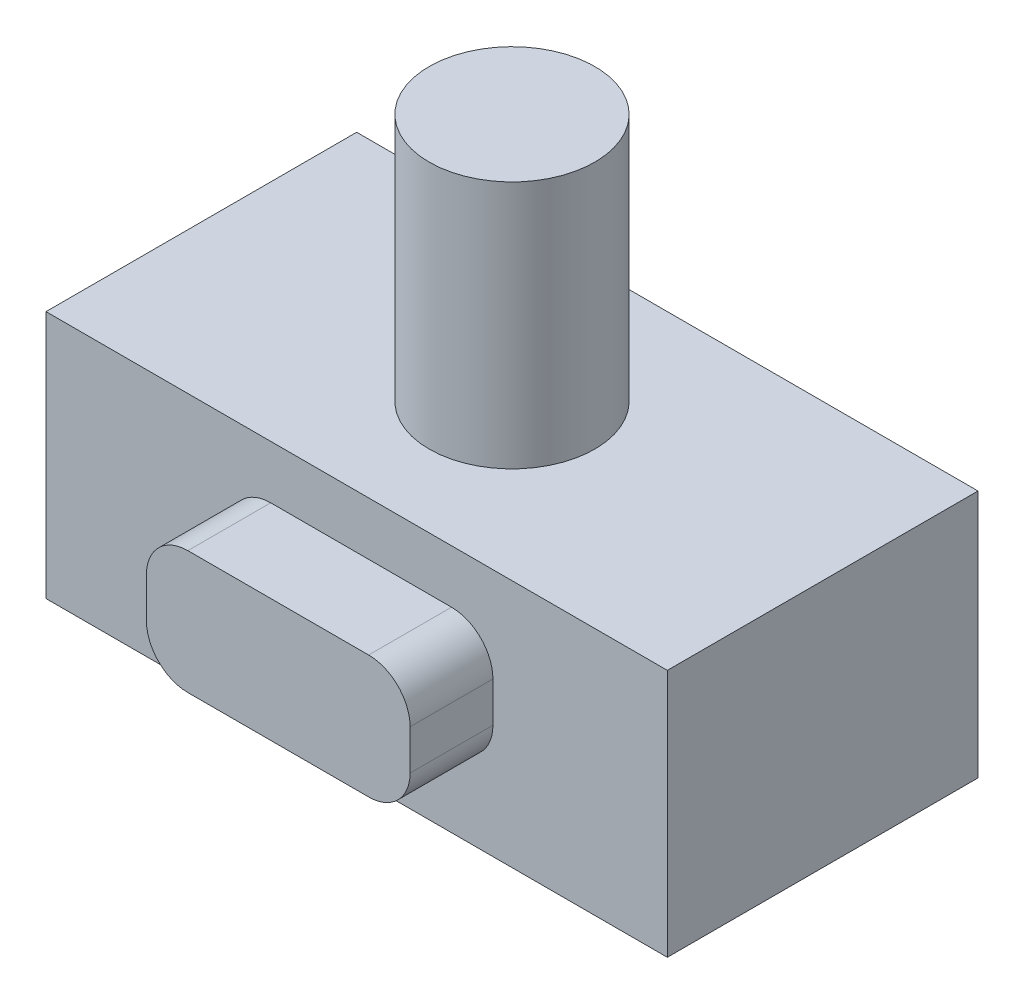
ISO-10303-21;
HEADER;
FILE_DESCRIPTION(('STEP AP214'),'2;1');
FILE_NAME('part.step','',(''),(''),'','','');
FILE_SCHEMA(('AUTOMOTIVE_DESIGN { 1 0 10303 214 1 1 1 1 }'));
ENDSEC;
DATA;
#1=APPLICATION_CONTEXT('core data for automotive mechanical design processes');
#2=APPLICATION_PROTOCOL_DEFINITION('international standard','automotive_design',2000,#1);
#3=PRODUCT_CONTEXT('',#1,'mechanical');
#4=PRODUCT('Part','Part','',(#3));
#5=PRODUCT_RELATED_PRODUCT_CATEGORY('part','',(#4));
#6=PRODUCT_DEFINITION_FORMATION('','',#4);
#7=PRODUCT_DEFINITION_CONTEXT('part definition',#1,'design');
#8=PRODUCT_DEFINITION('design','',#6,#7);
#9=PRODUCT_DEFINITION_SHAPE('','',#8);
#10=(LENGTH_UNIT() NAMED_UNIT(*) SI_UNIT(.MILLI.,.METRE.));
#11=(NAMED_UNIT(*) PLANE_ANGLE_UNIT() SI_UNIT($,.RADIAN.));
#12=(NAMED_UNIT(*) SI_UNIT($,.STERADIAN.) SOLID_ANGLE_UNIT());
#13=UNCERTAINTY_MEASURE_WITH_UNIT(LENGTH_MEASURE(1.E-05),#10,'distance_accuracy_value','');
#14=(GEOMETRIC_REPRESENTATION_CONTEXT(3) GLOBAL_UNCERTAINTY_ASSIGNED_CONTEXT((#13)) GLOBAL_UNIT_ASSIGNED_CONTEXT((#10,
#11,#12)) REPRESENTATION_CONTEXT('',''));
#15=CARTESIAN_POINT('',(0.,0.,0.));
#16=DIRECTION('',(0.,0.,1.));
#17=DIRECTION('',(1.,0.,0.));
#18=AXIS2_PLACEMENT_3D('',#15,#16,#17);
#19=CARTESIAN_POINT('',(-75.,60.,37.5));
#20=DIRECTION('',(0.,0.,-1.));
#21=DIRECTION('',(-1.,0.,0.));
#22=AXIS2_PLACEMENT_3D('',#19,#20,#21);
#23=PLANE('',#22);
#24=DIRECTION('',(1.,0.,0.));
#25=VECTOR('',#24,1.);
#26=CARTESIAN_POINT('',(-75.,0.,37.5));
#27=LINE('',#26,#25);
#28=CARTESIAN_POINT('',(-75.,0.,37.5));
#29=VERTEX_POINT('',#28);
#30=CARTESIAN_POINT('',(75.,0.,37.5));
#31=VERTEX_POINT('',#30);
#32=EDGE_CURVE('E258',#29,#31,#27,.T.);
#33=ORIENTED_EDGE('',*,*,#32,.T.);
#34=DIRECTION('',(0.,-1.,0.));
#35=VECTOR('',#34,1.);
#36=CARTESIAN_POINT('',(75.,60.,37.5));
#37=LINE('',#36,#35);
#38=CARTESIAN_POINT('',(75.,60.,37.5));
#39=VERTEX_POINT('',#38);
#40=EDGE_CURVE('E266',#39,#31,#37,.T.);
#41=ORIENTED_EDGE('',*,*,#40,.F.);
#42=DIRECTION('',(1.,0.,0.));
#43=VECTOR('',#42,1.);
#44=CARTESIAN_POINT('',(-75.,60.,37.5));
#45=LINE('',#44,#43);
#46=CARTESIAN_POINT('',(-75.,60.,37.5));
#47=VERTEX_POINT('',#46);
#48=EDGE_CURVE('E308',#47,#39,#45,.T.);
#49=ORIENTED_EDGE('',*,*,#48,.F.);
#50=DIRECTION('',(0.,-1.,0.));
#51=VECTOR('',#50,1.);
#52=CARTESIAN_POINT('',(-75.,60.,37.5));
#53=LINE('',#52,#51);
#54=EDGE_CURVE('E275',#47,#29,#53,.T.);
#55=ORIENTED_EDGE('',*,*,#54,.T.);
#56=EDGE_LOOP('',(#33,#41,#49,#55));
#57=FACE_BOUND('',#56,.T.);
#58=CARTESIAN_POINT('',(-20.7502949138701,27.4727216011498,37.5));
#59=DIRECTION('',(0.,0.,1.));
#60=DIRECTION('',(1.,0.,0.));
#61=AXIS2_PLACEMENT_3D('',#58,#59,#60);
#62=CIRCLE('',#61,10.);
#63=CARTESIAN_POINT('',(-30.7502949138701,27.4727216011498,37.5));
#64=VERTEX_POINT('',#63);
#65=CARTESIAN_POINT('',(-20.75029491387,17.4727216011498,37.5));
#66=VERTEX_POINT('',#65);
#67=EDGE_CURVE('E62',#64,#66,#62,.T.);
#68=ORIENTED_EDGE('',*,*,#67,.F.);
#69=DIRECTION('',(0.,-1.,0.));
#70=VECTOR('',#69,1.);
#71=CARTESIAN_POINT('',(-30.7502949138701,37.150331808722,37.5));
#72=LINE('',#71,#70);
#73=CARTESIAN_POINT('',(-30.7502949138701,37.150331808722,37.5));
#74=VERTEX_POINT('',#73);
#75=EDGE_CURVE('E66',#74,#64,#72,.T.);
#76=ORIENTED_EDGE('',*,*,#75,.F.);
#77=CARTESIAN_POINT('',(-20.7502949138701,37.1503318087221,37.5));
#78=DIRECTION('',(0.,0.,1.));
#79=DIRECTION('',(1.,0.,0.));
#80=AXIS2_PLACEMENT_3D('',#77,#78,#79);
#81=CIRCLE('',#80,10.);
#82=CARTESIAN_POINT('',(-20.75029491387,47.1503318087221,37.5));
#83=VERTEX_POINT('',#82);
#84=EDGE_CURVE('E355',#83,#74,#81,.T.);
#85=ORIENTED_EDGE('',*,*,#84,.F.);
#86=DIRECTION('',(-1.,0.,0.));
#87=VECTOR('',#86,1.);
#88=CARTESIAN_POINT('',(-20.75029491387,47.1503318087221,37.5));
#89=LINE('',#88,#87);
#90=CARTESIAN_POINT('',(22.8956643264656,47.1503318087221,37.5));
#91=VERTEX_POINT('',#90);
#92=EDGE_CURVE('E351',#91,#83,#89,.T.);
#93=ORIENTED_EDGE('',*,*,#92,.F.);
#94=CARTESIAN_POINT('',(22.8956643264657,37.1503318087221,37.5));
#95=DIRECTION('',(0.,0.,1.));
#96=DIRECTION('',(1.,0.,0.));
#97=AXIS2_PLACEMENT_3D('',#94,#95,#96);
#98=CIRCLE('',#97,10.);
#99=CARTESIAN_POINT('',(32.8956643264657,37.150331808722,37.5));
#100=VERTEX_POINT('',#99);
#101=EDGE_CURVE('E347',#100,#91,#98,.T.);
#102=ORIENTED_EDGE('',*,*,#101,.F.);
#103=DIRECTION('',(0.,1.,0.));
#104=VECTOR('',#103,1.);
#105=CARTESIAN_POINT('',(32.8956643264657,37.150331808722,37.5));
#106=LINE('',#105,#104);
#107=CARTESIAN_POINT('',(32.8956643264657,27.4727216011498,37.5));
#108=VERTEX_POINT('',#107);
#109=EDGE_CURVE('E343',#108,#100,#106,.T.);
#110=ORIENTED_EDGE('',*,*,#109,.F.);
#111=CARTESIAN_POINT('',(22.8956643264657,27.4727216011498,37.5));
#112=DIRECTION('',(0.,0.,1.));
#113=DIRECTION('',(1.,0.,0.));
#114=AXIS2_PLACEMENT_3D('',#111,#112,#113);
#115=CIRCLE('',#114,10.);
#116=CARTESIAN_POINT('',(22.8956643264656,17.4727216011498,37.5));
#117=VERTEX_POINT('',#116);
#118=EDGE_CURVE('E339',#117,#108,#115,.T.);
#119=ORIENTED_EDGE('',*,*,#118,.F.);
#120=DIRECTION('',(1.,0.,0.));
#121=VECTOR('',#120,1.);
#122=CARTESIAN_POINT('',(-20.75029491387,17.4727216011498,37.5));
#123=LINE('',#122,#121);
#124=EDGE_CURVE('E336',#66,#117,#123,.T.);
#125=ORIENTED_EDGE('',*,*,#124,.F.);
#126=EDGE_LOOP('',(#68,#76,#85,#93,#102,#110,#119,#125));
#127=FACE_BOUND('',#126,.T.);
#128=ADVANCED_FACE('F45',(#57,#127),#23,.F.);
#129=CARTESIAN_POINT('',(75.,60.,37.5));
#130=DIRECTION('',(-1.,0.,0.));
#131=DIRECTION('',(0.,0.,1.));
#132=AXIS2_PLACEMENT_3D('',#129,#130,#131);
#133=PLANE('',#132);
#134=DIRECTION('',(0.,0.,-1.));
#135=VECTOR('',#134,1.);
#136=CARTESIAN_POINT('',(75.,0.,37.5));
#137=LINE('',#136,#135);
#138=CARTESIAN_POINT('',(75.,0.,-37.5));
#139=VERTEX_POINT('',#138);
#140=EDGE_CURVE('E166',#31,#139,#137,.T.);
#141=ORIENTED_EDGE('',*,*,#140,.T.);
#142=DIRECTION('',(0.,-1.,0.));
#143=VECTOR('',#142,1.);
#144=CARTESIAN_POINT('',(75.,60.,-37.5));
#145=LINE('',#144,#143);
#146=CARTESIAN_POINT('',(75.,60.,-37.5));
#147=VERTEX_POINT('',#146);
#148=EDGE_CURVE('E49',#147,#139,#145,.T.);
#149=ORIENTED_EDGE('',*,*,#148,.F.);
#150=DIRECTION('',(0.,0.,-1.));
#151=VECTOR('',#150,1.);
#152=CARTESIAN_POINT('',(75.,60.,37.5));
#153=LINE('',#152,#151);
#154=EDGE_CURVE('E265',#39,#147,#153,.T.);
#155=ORIENTED_EDGE('',*,*,#154,.F.);
#156=ORIENTED_EDGE('',*,*,#40,.T.);
#157=EDGE_LOOP('',(#141,#149,#155,#156));
#158=FACE_BOUND('',#157,.T.);
#159=ADVANCED_FACE('F47',(#158),#133,.F.);
#160=CARTESIAN_POINT('',(-75.,60.,-37.5));
#161=DIRECTION('',(0.,0.,1.));
#162=DIRECTION('',(1.,0.,0.));
#163=AXIS2_PLACEMENT_3D('',#160,#161,#162);
#164=PLANE('',#163);
#165=DIRECTION('',(-1.,0.,0.));
#166=VECTOR('',#165,1.);
#167=CARTESIAN_POINT('',(-75.,0.,-37.5));
#168=LINE('',#167,#166);
#169=CARTESIAN_POINT('',(-75.,0.,-37.5));
#170=VERTEX_POINT('',#169);
#171=EDGE_CURVE('E259',#139,#170,#168,.T.);
#172=ORIENTED_EDGE('',*,*,#171,.T.);
#173=DIRECTION('',(0.,-1.,0.));
#174=VECTOR('',#173,1.);
#175=CARTESIAN_POINT('',(-75.,60.,-37.5));
#176=LINE('',#175,#174);
#177=CARTESIAN_POINT('',(-75.,60.,-37.5));
#178=VERTEX_POINT('',#177);
#179=EDGE_CURVE('E279',#178,#170,#176,.T.);
#180=ORIENTED_EDGE('',*,*,#179,.F.);
#181=DIRECTION('',(-1.,0.,0.));
#182=VECTOR('',#181,1.);
#183=CARTESIAN_POINT('',(-75.,60.,-37.5));
#184=LINE('',#183,#182);
#185=EDGE_CURVE('E293',#147,#178,#184,.T.);
#186=ORIENTED_EDGE('',*,*,#185,.F.);
#187=ORIENTED_EDGE('',*,*,#148,.T.);
#188=EDGE_LOOP('',(#172,#180,#186,#187));
#189=FACE_BOUND('',#188,.T.);
#190=ADVANCED_FACE('F292',(#189),#164,.F.);
#191=CARTESIAN_POINT('',(-75.,60.,37.5));
#192=DIRECTION('',(1.,0.,0.));
#193=DIRECTION('',(0.,0.,-1.));
#194=AXIS2_PLACEMENT_3D('',#191,#192,#193);
#195=PLANE('',#194);
#196=DIRECTION('',(0.,0.,1.));
#197=VECTOR('',#196,1.);
#198=CARTESIAN_POINT('',(-75.,0.,37.5));
#199=LINE('',#198,#197);
#200=EDGE_CURVE('E253',#170,#29,#199,.T.);
#201=ORIENTED_EDGE('',*,*,#200,.T.);
#202=ORIENTED_EDGE('',*,*,#54,.F.);
#203=DIRECTION('',(0.,0.,1.));
#204=VECTOR('',#203,1.);
#205=CARTESIAN_POINT('',(-75.,60.,37.5));
#206=LINE('',#205,#204);
#207=EDGE_CURVE('E323',#178,#47,#206,.T.);
#208=ORIENTED_EDGE('',*,*,#207,.F.);
#209=ORIENTED_EDGE('',*,*,#179,.T.);
#210=EDGE_LOOP('',(#201,#202,#208,#209));
#211=FACE_BOUND('',#210,.T.);
#212=ADVANCED_FACE('F453',(#211),#195,.F.);
#213=CARTESIAN_POINT('',(0.,60.,0.));
#214=DIRECTION('',(0.,-1.,0.));
#215=DIRECTION('',(0.,0.,-1.));
#216=AXIS2_PLACEMENT_3D('',#213,#214,#215);
#217=PLANE('',#216);
#218=CARTESIAN_POINT('',(0.,60.,0.));
#219=DIRECTION('',(0.,1.,0.));
#220=DIRECTION('',(0.,0.,1.));
#221=AXIS2_PLACEMENT_3D('',#218,#219,#220);
#222=CIRCLE('',#221,20.);
#223=CARTESIAN_POINT('',(0.,60.,20.));
#224=VERTEX_POINT('',#223);
#225=EDGE_CURVE('E12',#224,#224,#222,.T.);
#226=ORIENTED_EDGE('',*,*,#225,.F.);
#227=EDGE_LOOP('',(#226));
#228=FACE_BOUND('',#227,.T.);
#229=ORIENTED_EDGE('',*,*,#154,.T.);
#230=ORIENTED_EDGE('',*,*,#185,.T.);
#231=ORIENTED_EDGE('',*,*,#207,.T.);
#232=ORIENTED_EDGE('',*,*,#48,.T.);
#233=EDGE_LOOP('',(#229,#230,#231,#232));
#234=FACE_BOUND('',#233,.T.);
#235=ADVANCED_FACE('F455',(#228,#234),#217,.F.);
#236=CARTESIAN_POINT('',(0.,0.,0.));
#237=DIRECTION('',(0.,-1.,0.));
#238=DIRECTION('',(0.,0.,-1.));
#239=AXIS2_PLACEMENT_3D('',#236,#237,#238);
#240=PLANE('',#239);
#241=ORIENTED_EDGE('',*,*,#140,.F.);
#242=ORIENTED_EDGE('',*,*,#32,.F.);
#243=ORIENTED_EDGE('',*,*,#200,.F.);
#244=ORIENTED_EDGE('',*,*,#171,.F.);
#245=EDGE_LOOP('',(#241,#242,#243,#244));
#246=FACE_BOUND('',#245,.T.);
#247=ADVANCED_FACE('F451',(#246),#240,.T.);
#248=CARTESIAN_POINT('',(0.,120.,0.));
#249=DIRECTION('',(0.,-1.,0.));
#250=DIRECTION('',(0.,0.,-1.));
#251=AXIS2_PLACEMENT_3D('',#248,#249,#250);
#252=CYLINDRICAL_SURFACE('',#251,20.);
#253=CARTESIAN_POINT('',(0.,120.,0.));
#254=DIRECTION('',(0.,1.,0.));
#255=DIRECTION('',(0.,0.,1.));
#256=AXIS2_PLACEMENT_3D('',#253,#254,#255);
#257=CIRCLE('',#256,20.);
#258=CARTESIAN_POINT('',(0.,120.,20.));
#259=VERTEX_POINT('',#258);
#260=EDGE_CURVE('E160',#259,#259,#257,.T.);
#261=ORIENTED_EDGE('',*,*,#260,.F.);
#262=EDGE_LOOP('',(#261));
#263=FACE_BOUND('',#262,.T.);
#264=ORIENTED_EDGE('',*,*,#225,.T.);
#265=EDGE_LOOP('',(#264));
#266=FACE_BOUND('',#265,.T.);
#267=ADVANCED_FACE('F480',(#263,#266),#252,.T.);
#268=CARTESIAN_POINT('',(0.,120.,0.));
#269=DIRECTION('',(0.,1.,0.));
#270=DIRECTION('',(0.,0.,1.));
#271=AXIS2_PLACEMENT_3D('',#268,#269,#270);
#272=PLANE('',#271);
#273=ORIENTED_EDGE('',*,*,#260,.T.);
#274=EDGE_LOOP('',(#273));
#275=FACE_BOUND('',#274,.T.);
#276=ADVANCED_FACE('F486',(#275),#272,.T.);
#277=CARTESIAN_POINT('',(-20.7502949138701,27.4727216011498,57.5));
#278=DIRECTION('',(0.,0.,-1.));
#279=DIRECTION('',(-1.,0.,0.));
#280=AXIS2_PLACEMENT_3D('',#277,#278,#279);
#281=CYLINDRICAL_SURFACE('',#280,10.);
#282=ORIENTED_EDGE('',*,*,#67,.T.);
#283=DIRECTION('',(0.,0.,-1.));
#284=VECTOR('',#283,1.);
#285=CARTESIAN_POINT('',(-20.75029491387,17.4727216011498,57.5));
#286=LINE('',#285,#284);
#287=CARTESIAN_POINT('',(-20.75029491387,17.4727216011498,57.5));
#288=VERTEX_POINT('',#287);
#289=EDGE_CURVE('E139',#288,#66,#286,.T.);
#290=ORIENTED_EDGE('',*,*,#289,.F.);
#291=CARTESIAN_POINT('',(-20.7502949138701,27.4727216011498,57.5));
#292=DIRECTION('',(0.,0.,1.));
#293=DIRECTION('',(1.,0.,0.));
#294=AXIS2_PLACEMENT_3D('',#291,#292,#293);
#295=CIRCLE('',#294,10.);
#296=CARTESIAN_POINT('',(-30.7502949138701,27.4727216011498,57.5));
#297=VERTEX_POINT('',#296);
#298=EDGE_CURVE('E146',#297,#288,#295,.T.);
#299=ORIENTED_EDGE('',*,*,#298,.F.);
#300=DIRECTION('',(0.,0.,-1.));
#301=VECTOR('',#300,1.);
#302=CARTESIAN_POINT('',(-30.7502949138701,27.4727216011498,57.5));
#303=LINE('',#302,#301);
#304=EDGE_CURVE('E374',#297,#64,#303,.T.);
#305=ORIENTED_EDGE('',*,*,#304,.T.);
#306=EDGE_LOOP('',(#282,#290,#299,#305));
#307=FACE_BOUND('',#306,.T.);
#308=ADVANCED_FACE('F158',(#307),#281,.T.);
#309=CARTESIAN_POINT('',(-20.75029491387,17.4727216011498,57.5));
#310=DIRECTION('',(0.,1.,0.));
#311=DIRECTION('',(0.,0.,1.));
#312=AXIS2_PLACEMENT_3D('',#309,#310,#311);
#313=PLANE('',#312);
#314=ORIENTED_EDGE('',*,*,#124,.T.);
#315=DIRECTION('',(0.,0.,-1.));
#316=VECTOR('',#315,1.);
#317=CARTESIAN_POINT('',(22.8956643264656,17.4727216011498,57.5));
#318=LINE('',#317,#316);
#319=CARTESIAN_POINT('',(22.8956643264656,17.4727216011498,57.5));
#320=VERTEX_POINT('',#319);
#321=EDGE_CURVE('E141',#320,#117,#318,.T.);
#322=ORIENTED_EDGE('',*,*,#321,.F.);
#323=DIRECTION('',(1.,0.,0.));
#324=VECTOR('',#323,1.);
#325=CARTESIAN_POINT('',(-20.75029491387,17.4727216011498,57.5));
#326=LINE('',#325,#324);
#327=EDGE_CURVE('E134',#288,#320,#326,.T.);
#328=ORIENTED_EDGE('',*,*,#327,.F.);
#329=ORIENTED_EDGE('',*,*,#289,.T.);
#330=EDGE_LOOP('',(#314,#322,#328,#329));
#331=FACE_BOUND('',#330,.T.);
#332=ADVANCED_FACE('F137',(#331),#313,.F.);
#333=CARTESIAN_POINT('',(22.8956643264657,27.4727216011498,57.5));
#334=DIRECTION('',(0.,0.,-1.));
#335=DIRECTION('',(-1.,0.,0.));
#336=AXIS2_PLACEMENT_3D('',#333,#334,#335);
#337=CYLINDRICAL_SURFACE('',#336,10.);
#338=ORIENTED_EDGE('',*,*,#118,.T.);
#339=DIRECTION('',(0.,0.,-1.));
#340=VECTOR('',#339,1.);
#341=CARTESIAN_POINT('',(32.8956643264657,27.4727216011498,57.5));
#342=LINE('',#341,#340);
#343=CARTESIAN_POINT('',(32.8956643264657,27.4727216011498,57.5));
#344=VERTEX_POINT('',#343);
#345=EDGE_CURVE('E168',#344,#108,#342,.T.);
#346=ORIENTED_EDGE('',*,*,#345,.F.);
#347=CARTESIAN_POINT('',(22.8956643264657,27.4727216011498,57.5));
#348=DIRECTION('',(0.,0.,1.));
#349=DIRECTION('',(1.,0.,0.));
#350=AXIS2_PLACEMENT_3D('',#347,#348,#349);
#351=CIRCLE('',#350,10.);
#352=EDGE_CURVE('E145',#320,#344,#351,.T.);
#353=ORIENTED_EDGE('',*,*,#352,.F.);
#354=ORIENTED_EDGE('',*,*,#321,.T.);
#355=EDGE_LOOP('',(#338,#346,#353,#354));
#356=FACE_BOUND('',#355,.T.);
#357=ADVANCED_FACE('F418',(#356),#337,.T.);
#358=CARTESIAN_POINT('',(32.8956643264657,37.150331808722,57.5));
#359=DIRECTION('',(-1.,0.,0.));
#360=DIRECTION('',(0.,0.,1.));
#361=AXIS2_PLACEMENT_3D('',#358,#359,#360);
#362=PLANE('',#361);
#363=ORIENTED_EDGE('',*,*,#109,.T.);
#364=DIRECTION('',(0.,0.,-1.));
#365=VECTOR('',#364,1.);
#366=CARTESIAN_POINT('',(32.8956643264657,37.150331808722,57.5));
#367=LINE('',#366,#365);
#368=CARTESIAN_POINT('',(32.8956643264657,37.150331808722,57.5));
#369=VERTEX_POINT('',#368);
#370=EDGE_CURVE('E405',#369,#100,#367,.T.);
#371=ORIENTED_EDGE('',*,*,#370,.F.);
#372=DIRECTION('',(0.,1.,0.));
#373=VECTOR('',#372,1.);
#374=CARTESIAN_POINT('',(32.8956643264657,37.150331808722,57.5));
#375=LINE('',#374,#373);
#376=EDGE_CURVE('E362',#344,#369,#375,.T.);
#377=ORIENTED_EDGE('',*,*,#376,.F.);
#378=ORIENTED_EDGE('',*,*,#345,.T.);
#379=EDGE_LOOP('',(#363,#371,#377,#378));
#380=FACE_BOUND('',#379,.T.);
#381=ADVANCED_FACE('F415',(#380),#362,.F.);
#382=CARTESIAN_POINT('',(22.8956643264657,37.1503318087221,57.5));
#383=DIRECTION('',(0.,0.,-1.));
#384=DIRECTION('',(-1.,0.,0.));
#385=AXIS2_PLACEMENT_3D('',#382,#383,#384);
#386=CYLINDRICAL_SURFACE('',#385,10.);
#387=ORIENTED_EDGE('',*,*,#101,.T.);
#388=DIRECTION('',(0.,0.,-1.));
#389=VECTOR('',#388,1.);
#390=CARTESIAN_POINT('',(22.8956643264656,47.1503318087221,57.5));
#391=LINE('',#390,#389);
#392=CARTESIAN_POINT('',(22.8956643264656,47.1503318087221,57.5));
#393=VERTEX_POINT('',#392);
#394=EDGE_CURVE('E400',#393,#91,#391,.T.);
#395=ORIENTED_EDGE('',*,*,#394,.F.);
#396=CARTESIAN_POINT('',(22.8956643264657,37.1503318087221,57.5));
#397=DIRECTION('',(0.,0.,1.));
#398=DIRECTION('',(1.,0.,0.));
#399=AXIS2_PLACEMENT_3D('',#396,#397,#398);
#400=CIRCLE('',#399,10.);
#401=EDGE_CURVE('E365',#369,#393,#400,.T.);
#402=ORIENTED_EDGE('',*,*,#401,.F.);
#403=ORIENTED_EDGE('',*,*,#370,.T.);
#404=EDGE_LOOP('',(#387,#395,#402,#403));
#405=FACE_BOUND('',#404,.T.);
#406=ADVANCED_FACE('F422',(#405),#386,.T.);
#407=CARTESIAN_POINT('',(-20.75029491387,47.1503318087221,57.5));
#408=DIRECTION('',(0.,-1.,0.));
#409=DIRECTION('',(0.,0.,-1.));
#410=AXIS2_PLACEMENT_3D('',#407,#408,#409);
#411=PLANE('',#410);
#412=ORIENTED_EDGE('',*,*,#92,.T.);
#413=DIRECTION('',(0.,0.,-1.));
#414=VECTOR('',#413,1.);
#415=CARTESIAN_POINT('',(-20.75029491387,47.1503318087221,57.5));
#416=LINE('',#415,#414);
#417=CARTESIAN_POINT('',(-20.75029491387,47.1503318087221,57.5));
#418=VERTEX_POINT('',#417);
#419=EDGE_CURVE('E395',#418,#83,#416,.T.);
#420=ORIENTED_EDGE('',*,*,#419,.F.);
#421=DIRECTION('',(-1.,0.,0.));
#422=VECTOR('',#421,1.);
#423=CARTESIAN_POINT('',(-20.75029491387,47.1503318087221,57.5));
#424=LINE('',#423,#422);
#425=EDGE_CURVE('E368',#393,#418,#424,.T.);
#426=ORIENTED_EDGE('',*,*,#425,.F.);
#427=ORIENTED_EDGE('',*,*,#394,.T.);
#428=EDGE_LOOP('',(#412,#420,#426,#427));
#429=FACE_BOUND('',#428,.T.);
#430=ADVANCED_FACE('F426',(#429),#411,.F.);
#431=CARTESIAN_POINT('',(-20.7502949138701,37.1503318087221,57.5));
#432=DIRECTION('',(0.,0.,-1.));
#433=DIRECTION('',(-1.,0.,0.));
#434=AXIS2_PLACEMENT_3D('',#431,#432,#433);
#435=CYLINDRICAL_SURFACE('',#434,10.);
#436=ORIENTED_EDGE('',*,*,#84,.T.);
#437=DIRECTION('',(0.,0.,-1.));
#438=VECTOR('',#437,1.);
#439=CARTESIAN_POINT('',(-30.7502949138701,37.150331808722,57.5));
#440=LINE('',#439,#438);
#441=CARTESIAN_POINT('',(-30.7502949138701,37.150331808722,57.5));
#442=VERTEX_POINT('',#441);
#443=EDGE_CURVE('E377',#442,#74,#440,.T.);
#444=ORIENTED_EDGE('',*,*,#443,.F.);
#445=CARTESIAN_POINT('',(-20.7502949138701,37.1503318087221,57.5));
#446=DIRECTION('',(0.,0.,1.));
#447=DIRECTION('',(1.,0.,0.));
#448=AXIS2_PLACEMENT_3D('',#445,#446,#447);
#449=CIRCLE('',#448,10.);
#450=EDGE_CURVE('E371',#418,#442,#449,.T.);
#451=ORIENTED_EDGE('',*,*,#450,.F.);
#452=ORIENTED_EDGE('',*,*,#419,.T.);
#453=EDGE_LOOP('',(#436,#444,#451,#452));
#454=FACE_BOUND('',#453,.T.);
#455=ADVANCED_FACE('F432',(#454),#435,.T.);
#456=CARTESIAN_POINT('',(-30.7502949138701,37.150331808722,57.5));
#457=DIRECTION('',(1.,0.,0.));
#458=DIRECTION('',(0.,0.,-1.));
#459=AXIS2_PLACEMENT_3D('',#456,#457,#458);
#460=PLANE('',#459);
#461=ORIENTED_EDGE('',*,*,#75,.T.);
#462=ORIENTED_EDGE('',*,*,#304,.F.);
#463=DIRECTION('',(0.,-1.,0.));
#464=VECTOR('',#463,1.);
#465=CARTESIAN_POINT('',(-30.7502949138701,37.150331808722,57.5));
#466=LINE('',#465,#464);
#467=EDGE_CURVE('E152',#442,#297,#466,.T.);
#468=ORIENTED_EDGE('',*,*,#467,.F.);
#469=ORIENTED_EDGE('',*,*,#443,.T.);
#470=EDGE_LOOP('',(#461,#462,#468,#469));
#471=FACE_BOUND('',#470,.T.);
#472=ADVANCED_FACE('F434',(#471),#460,.F.);
#473=CARTESIAN_POINT('',(-20.7502949138701,27.4727216011498,57.5));
#474=DIRECTION('',(0.,0.,1.));
#475=DIRECTION('',(1.,0.,0.));
#476=AXIS2_PLACEMENT_3D('',#473,#474,#475);
#477=PLANE('',#476);
#478=ORIENTED_EDGE('',*,*,#298,.T.);
#479=ORIENTED_EDGE('',*,*,#327,.T.);
#480=ORIENTED_EDGE('',*,*,#352,.T.);
#481=ORIENTED_EDGE('',*,*,#376,.T.);
#482=ORIENTED_EDGE('',*,*,#401,.T.);
#483=ORIENTED_EDGE('',*,*,#425,.T.);
#484=ORIENTED_EDGE('',*,*,#450,.T.);
#485=ORIENTED_EDGE('',*,*,#467,.T.);
#486=EDGE_LOOP('',(#478,#479,#480,#481,#482,#483,#484,#485));
#487=FACE_BOUND('',#486,.T.);
#488=ADVANCED_FACE('F150',(#487),#477,.T.);
#489=CLOSED_SHELL('',(#128,#159,#190,#212,#235,#247,#267,#276,#308,#332,#357,#381,#406,#430,
#455,#472,#488));
#490=MANIFOLD_SOLID_BREP('B2',#489);
#491=ADVANCED_BREP_SHAPE_REPRESENTATION('',(#18,#490),#14);
#492=SHAPE_DEFINITION_REPRESENTATION(#9,#491);
ENDSEC;
END-ISO-10303-21;
